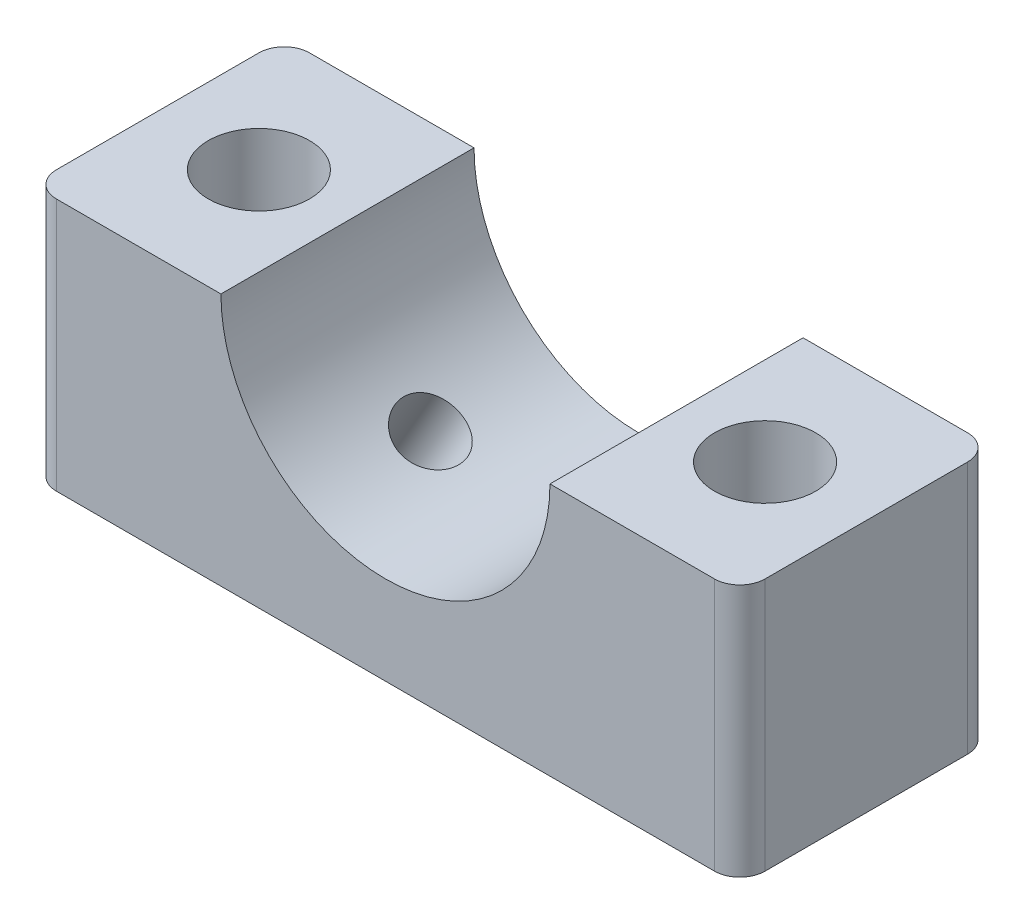
ISO-10303-21;
HEADER;
FILE_DESCRIPTION(('STEP AP214'),'2;1');
FILE_NAME('part.step','',(''),(''),'','','');
FILE_SCHEMA(('AUTOMOTIVE_DESIGN { 1 0 10303 214 1 1 1 1 }'));
ENDSEC;
DATA;
#1=APPLICATION_CONTEXT('core data for automotive mechanical design processes');
#2=APPLICATION_PROTOCOL_DEFINITION('international standard','automotive_design',2000,#1);
#3=PRODUCT_CONTEXT('',#1,'mechanical');
#4=PRODUCT('Part','Part','',(#3));
#5=PRODUCT_RELATED_PRODUCT_CATEGORY('part','',(#4));
#6=PRODUCT_DEFINITION_FORMATION('','',#4);
#7=PRODUCT_DEFINITION_CONTEXT('part definition',#1,'design');
#8=PRODUCT_DEFINITION('design','',#6,#7);
#9=PRODUCT_DEFINITION_SHAPE('','',#8);
#10=(LENGTH_UNIT() NAMED_UNIT(*) SI_UNIT(.MILLI.,.METRE.));
#11=(NAMED_UNIT(*) PLANE_ANGLE_UNIT() SI_UNIT($,.RADIAN.));
#12=(NAMED_UNIT(*) SI_UNIT($,.STERADIAN.) SOLID_ANGLE_UNIT());
#13=UNCERTAINTY_MEASURE_WITH_UNIT(LENGTH_MEASURE(1.E-05),#10,'distance_accuracy_value','');
#14=(GEOMETRIC_REPRESENTATION_CONTEXT(3) GLOBAL_UNCERTAINTY_ASSIGNED_CONTEXT((#13)) GLOBAL_UNIT_ASSIGNED_CONTEXT((#10,
#11,#12)) REPRESENTATION_CONTEXT('',''));
#15=CARTESIAN_POINT('',(0.,0.,0.));
#16=DIRECTION('',(0.,0.,1.));
#17=DIRECTION('',(1.,0.,0.));
#18=AXIS2_PLACEMENT_3D('',#15,#16,#17);
#19=CARTESIAN_POINT('',(-14.,10.,5.));
#20=DIRECTION('',(1.,0.,0.));
#21=DIRECTION('',(0.,0.,-1.));
#22=AXIS2_PLACEMENT_3D('',#19,#20,#21);
#23=PLANE('',#22);
#24=DIRECTION('',(0.,0.,-1.));
#25=VECTOR('',#24,1.);
#26=CARTESIAN_POINT('',(-14.,10.,5.));
#27=LINE('',#26,#25);
#28=CARTESIAN_POINT('',(-14.,10.,4.));
#29=VERTEX_POINT('',#28);
#30=CARTESIAN_POINT('',(-14.,10.,-4.));
#31=VERTEX_POINT('',#30);
#32=EDGE_CURVE('E141',#29,#31,#27,.T.);
#33=ORIENTED_EDGE('',*,*,#32,.T.);
#34=DIRECTION('',(0.,-1.,0.));
#35=VECTOR('',#34,1.);
#36=CARTESIAN_POINT('',(-14.,10.,-4.));
#37=LINE('',#36,#35);
#38=CARTESIAN_POINT('',(-14.,0.,-4.));
#39=VERTEX_POINT('',#38);
#40=EDGE_CURVE('E244',#31,#39,#37,.T.);
#41=ORIENTED_EDGE('',*,*,#40,.T.);
#42=DIRECTION('',(0.,0.,-1.));
#43=VECTOR('',#42,1.);
#44=CARTESIAN_POINT('',(-14.,0.,5.));
#45=LINE('',#44,#43);
#46=CARTESIAN_POINT('',(-14.,0.,4.));
#47=VERTEX_POINT('',#46);
#48=EDGE_CURVE('E163',#47,#39,#45,.T.);
#49=ORIENTED_EDGE('',*,*,#48,.F.);
#50=DIRECTION('',(0.,-1.,0.));
#51=VECTOR('',#50,1.);
#52=CARTESIAN_POINT('',(-14.,10.,4.));
#53=LINE('',#52,#51);
#54=EDGE_CURVE('E170',#47,#29,#53,.F.);
#55=ORIENTED_EDGE('',*,*,#54,.T.);
#56=EDGE_LOOP('',(#33,#41,#49,#55));
#57=FACE_BOUND('',#56,.T.);
#58=ADVANCED_FACE('F39',(#57),#23,.F.);
#59=CARTESIAN_POINT('',(-14.,0.,5.));
#60=DIRECTION('',(0.,1.,0.));
#61=DIRECTION('',(0.,0.,1.));
#62=AXIS2_PLACEMENT_3D('',#59,#60,#61);
#63=PLANE('',#62);
#64=CARTESIAN_POINT('',(-10.,0.,0.));
#65=DIRECTION('',(0.,1.,0.));
#66=DIRECTION('',(0.,0.,1.));
#67=AXIS2_PLACEMENT_3D('',#64,#65,#66);
#68=CIRCLE('',#67,2.);
#69=CARTESIAN_POINT('',(-10.,0.,2.));
#70=VERTEX_POINT('',#69);
#71=EDGE_CURVE('E178',#70,#70,#68,.F.);
#72=ORIENTED_EDGE('',*,*,#71,.F.);
#73=EDGE_LOOP('',(#72));
#74=FACE_BOUND('',#73,.T.);
#75=CARTESIAN_POINT('',(10.,0.,0.));
#76=DIRECTION('',(0.,1.,0.));
#77=DIRECTION('',(0.,0.,1.));
#78=AXIS2_PLACEMENT_3D('',#75,#76,#77);
#79=CIRCLE('',#78,2.);
#80=CARTESIAN_POINT('',(10.,0.,2.));
#81=VERTEX_POINT('',#80);
#82=EDGE_CURVE('E268',#81,#81,#79,.F.);
#83=ORIENTED_EDGE('',*,*,#82,.F.);
#84=EDGE_LOOP('',(#83));
#85=FACE_BOUND('',#84,.T.);
#86=CARTESIAN_POINT('',(-5.77350269189618,0.,0.));
#87=DIRECTION('',(0.,1.,0.));
#88=DIRECTION('',(1.,0.,0.));
#89=AXIS2_PLACEMENT_3D('',#86,#87,#88);
#90=ELLIPSE('',#89,1.44337567297406,1.25);
#91=CARTESIAN_POINT('',(-4.33012701892212,0.,0.));
#92=VERTEX_POINT('',#91);
#93=EDGE_CURVE('E147',#92,#92,#90,.T.);
#94=ORIENTED_EDGE('',*,*,#93,.T.);
#95=EDGE_LOOP('',(#94));
#96=FACE_BOUND('',#95,.T.);
#97=ORIENTED_EDGE('',*,*,#48,.T.);
#98=CARTESIAN_POINT('',(-13.,0.,-4.));
#99=DIRECTION('',(0.,1.,0.));
#100=DIRECTION('',(0.,0.,1.));
#101=AXIS2_PLACEMENT_3D('',#98,#99,#100);
#102=CIRCLE('',#101,1.);
#103=CARTESIAN_POINT('',(-13.,0.,-5.));
#104=VERTEX_POINT('',#103);
#105=EDGE_CURVE('E239',#39,#104,#102,.F.);
#106=ORIENTED_EDGE('',*,*,#105,.T.);
#107=DIRECTION('',(1.,0.,0.));
#108=VECTOR('',#107,1.);
#109=CARTESIAN_POINT('',(-14.,0.,-5.));
#110=LINE('',#109,#108);
#111=CARTESIAN_POINT('',(13.,0.,-5.));
#112=VERTEX_POINT('',#111);
#113=EDGE_CURVE('E150',#104,#112,#110,.T.);
#114=ORIENTED_EDGE('',*,*,#113,.T.);
#115=CARTESIAN_POINT('',(13.,0.,-4.));
#116=DIRECTION('',(0.,1.,0.));
#117=DIRECTION('',(0.,0.,1.));
#118=AXIS2_PLACEMENT_3D('',#115,#116,#117);
#119=CIRCLE('',#118,1.);
#120=CARTESIAN_POINT('',(14.,0.,-4.));
#121=VERTEX_POINT('',#120);
#122=EDGE_CURVE('E237',#112,#121,#119,.F.);
#123=ORIENTED_EDGE('',*,*,#122,.T.);
#124=DIRECTION('',(0.,0.,-1.));
#125=VECTOR('',#124,1.);
#126=CARTESIAN_POINT('',(14.,0.,5.));
#127=LINE('',#126,#125);
#128=CARTESIAN_POINT('',(14.,0.,4.));
#129=VERTEX_POINT('',#128);
#130=EDGE_CURVE('E161',#129,#121,#127,.T.);
#131=ORIENTED_EDGE('',*,*,#130,.F.);
#132=CARTESIAN_POINT('',(13.,0.,4.));
#133=DIRECTION('',(0.,1.,0.));
#134=DIRECTION('',(0.,0.,1.));
#135=AXIS2_PLACEMENT_3D('',#132,#133,#134);
#136=CIRCLE('',#135,1.);
#137=CARTESIAN_POINT('',(13.,0.,5.));
#138=VERTEX_POINT('',#137);
#139=EDGE_CURVE('E233',#129,#138,#136,.F.);
#140=ORIENTED_EDGE('',*,*,#139,.T.);
#141=DIRECTION('',(1.,0.,0.));
#142=VECTOR('',#141,1.);
#143=CARTESIAN_POINT('',(-14.,0.,5.));
#144=LINE('',#143,#142);
#145=CARTESIAN_POINT('',(-13.,0.,5.));
#146=VERTEX_POINT('',#145);
#147=EDGE_CURVE('E124',#146,#138,#144,.T.);
#148=ORIENTED_EDGE('',*,*,#147,.F.);
#149=CARTESIAN_POINT('',(-13.,0.,4.));
#150=DIRECTION('',(0.,1.,0.));
#151=DIRECTION('',(0.,0.,1.));
#152=AXIS2_PLACEMENT_3D('',#149,#150,#151);
#153=CIRCLE('',#152,1.);
#154=EDGE_CURVE('E240',#146,#47,#153,.F.);
#155=ORIENTED_EDGE('',*,*,#154,.T.);
#156=EDGE_LOOP('',(#97,#106,#114,#123,#131,#140,#148,#155));
#157=FACE_BOUND('',#156,.T.);
#158=ADVANCED_FACE('F206',(#74,#85,#96,#157),#63,.F.);
#159=CARTESIAN_POINT('',(14.,10.,5.));
#160=DIRECTION('',(-1.,0.,0.));
#161=DIRECTION('',(0.,0.,1.));
#162=AXIS2_PLACEMENT_3D('',#159,#160,#161);
#163=PLANE('',#162);
#164=ORIENTED_EDGE('',*,*,#130,.T.);
#165=DIRECTION('',(0.,1.,0.));
#166=VECTOR('',#165,1.);
#167=CARTESIAN_POINT('',(14.,10.,-4.));
#168=LINE('',#167,#166);
#169=CARTESIAN_POINT('',(14.,10.,-4.));
#170=VERTEX_POINT('',#169);
#171=EDGE_CURVE('E255',#121,#170,#168,.T.);
#172=ORIENTED_EDGE('',*,*,#171,.T.);
#173=DIRECTION('',(0.,0.,-1.));
#174=VECTOR('',#173,1.);
#175=CARTESIAN_POINT('',(14.,10.,5.));
#176=LINE('',#175,#174);
#177=CARTESIAN_POINT('',(14.,10.,4.));
#178=VERTEX_POINT('',#177);
#179=EDGE_CURVE('E132',#178,#170,#176,.T.);
#180=ORIENTED_EDGE('',*,*,#179,.F.);
#181=DIRECTION('',(0.,1.,0.));
#182=VECTOR('',#181,1.);
#183=CARTESIAN_POINT('',(14.,0.,4.));
#184=LINE('',#183,#182);
#185=EDGE_CURVE('E235',#178,#129,#184,.F.);
#186=ORIENTED_EDGE('',*,*,#185,.T.);
#187=EDGE_LOOP('',(#164,#172,#180,#186));
#188=FACE_BOUND('',#187,.T.);
#189=ADVANCED_FACE('F213',(#188),#163,.F.);
#190=CARTESIAN_POINT('',(6.5,10.,5.));
#191=DIRECTION('',(0.,-1.,0.));
#192=DIRECTION('',(0.,0.,-1.));
#193=AXIS2_PLACEMENT_3D('',#190,#191,#192);
#194=PLANE('',#193);
#195=CARTESIAN_POINT('',(10.,10.,0.));
#196=DIRECTION('',(0.,1.,0.));
#197=DIRECTION('',(0.,0.,1.));
#198=AXIS2_PLACEMENT_3D('',#195,#196,#197);
#199=CIRCLE('',#198,2.);
#200=CARTESIAN_POINT('',(10.,10.,2.));
#201=VERTEX_POINT('',#200);
#202=EDGE_CURVE('E262',#201,#201,#199,.T.);
#203=ORIENTED_EDGE('',*,*,#202,.F.);
#204=EDGE_LOOP('',(#203));
#205=FACE_BOUND('',#204,.T.);
#206=ORIENTED_EDGE('',*,*,#179,.T.);
#207=CARTESIAN_POINT('',(13.,10.,-4.));
#208=DIRECTION('',(0.,-1.,0.));
#209=DIRECTION('',(0.,0.,-1.));
#210=AXIS2_PLACEMENT_3D('',#207,#208,#209);
#211=CIRCLE('',#210,1.);
#212=CARTESIAN_POINT('',(13.,10.,-5.));
#213=VERTEX_POINT('',#212);
#214=EDGE_CURVE('E64',#170,#213,#211,.F.);
#215=ORIENTED_EDGE('',*,*,#214,.T.);
#216=DIRECTION('',(-1.,0.,0.));
#217=VECTOR('',#216,1.);
#218=CARTESIAN_POINT('',(6.5,10.,-5.));
#219=LINE('',#218,#217);
#220=CARTESIAN_POINT('',(6.5,10.,-5.));
#221=VERTEX_POINT('',#220);
#222=EDGE_CURVE('E131',#213,#221,#219,.T.);
#223=ORIENTED_EDGE('',*,*,#222,.T.);
#224=DIRECTION('',(0.,0.,-1.));
#225=VECTOR('',#224,1.);
#226=CARTESIAN_POINT('',(6.5,10.,5.));
#227=LINE('',#226,#225);
#228=CARTESIAN_POINT('',(6.5,10.,5.));
#229=VERTEX_POINT('',#228);
#230=EDGE_CURVE('E126',#229,#221,#227,.T.);
#231=ORIENTED_EDGE('',*,*,#230,.F.);
#232=DIRECTION('',(-1.,0.,0.));
#233=VECTOR('',#232,1.);
#234=CARTESIAN_POINT('',(6.5,10.,5.));
#235=LINE('',#234,#233);
#236=CARTESIAN_POINT('',(13.,10.,5.));
#237=VERTEX_POINT('',#236);
#238=EDGE_CURVE('E119',#237,#229,#235,.T.);
#239=ORIENTED_EDGE('',*,*,#238,.F.);
#240=CARTESIAN_POINT('',(13.,10.,4.));
#241=DIRECTION('',(0.,-1.,0.));
#242=DIRECTION('',(0.,0.,-1.));
#243=AXIS2_PLACEMENT_3D('',#240,#241,#242);
#244=CIRCLE('',#243,1.);
#245=EDGE_CURVE('E53',#237,#178,#244,.F.);
#246=ORIENTED_EDGE('',*,*,#245,.T.);
#247=EDGE_LOOP('',(#206,#215,#223,#231,#239,#246));
#248=FACE_BOUND('',#247,.T.);
#249=ADVANCED_FACE('F128',(#205,#248),#194,.F.);
#250=CARTESIAN_POINT('',(0.,10.,5.));
#251=DIRECTION('',(0.,0.,-1.));
#252=DIRECTION('',(-1.,0.,0.));
#253=AXIS2_PLACEMENT_3D('',#250,#251,#252);
#254=CYLINDRICAL_SURFACE('',#253,6.5);
#255=CARTESIAN_POINT('',(-4.27186946027379,5.10090505150388,0.));
#256=CARTESIAN_POINT('',(-4.27186786234572,5.10090255690933,-0.0695129298701198));
#257=CARTESIAN_POINT('',(-4.26740512682388,5.09700122847107,-0.139059615060495));
#258=CARTESIAN_POINT('',(-4.24963701126365,5.08159391997354,-0.276189529414037));
#259=CARTESIAN_POINT('',(-4.23632429076355,5.07008162717971,-0.343771080023577));
#260=CARTESIAN_POINT('',(-4.20114024976737,5.04006538431201,-0.474966822381258));
#261=CARTESIAN_POINT('',(-4.17927710502213,5.02156811371931,-0.538584736914954));
#262=CARTESIAN_POINT('',(-4.12742162531225,4.97849407623224,-0.660186274966829));
#263=CARTESIAN_POINT('',(-4.09742985625943,4.95391773257111,-0.71817029033336));
#264=CARTESIAN_POINT('',(-4.02948728504457,4.89949575207392,-0.82762060621887));
#265=CARTESIAN_POINT('',(-3.9914472491581,4.86959168736392,-0.879002474754331));
#266=CARTESIAN_POINT('',(-3.90837101927232,4.80602594237118,-0.973053765073603));
#267=CARTESIAN_POINT('',(-3.86333435476037,4.77236400942037,-1.01572260047221));
#268=CARTESIAN_POINT('',(-3.76681408584734,4.70238849172243,-1.09146170512889));
#269=CARTESIAN_POINT('',(-3.71528160693781,4.66605578122765,-1.12445212935253));
#270=CARTESIAN_POINT('',(-3.60725951597224,4.59241772086044,-1.17938321266358));
#271=CARTESIAN_POINT('',(-3.5507703332067,4.55511245541544,-1.20132482755992));
#272=CARTESIAN_POINT('',(-3.4350041577032,4.48135911982108,-1.23327370175281));
#273=CARTESIAN_POINT('',(-3.37576961815053,4.44490614484092,-1.24342338756003));
#274=CARTESIAN_POINT('',(-3.25552415623735,4.37359382706998,-1.25194429161107));
#275=CARTESIAN_POINT('',(-3.19451339314361,4.33873434211342,-1.250316562668));
#276=CARTESIAN_POINT('',(-3.07331712468633,4.27204701198184,-1.23543761869705));
#277=CARTESIAN_POINT('',(-3.01313133400894,4.24018528352899,-1.22233978343455));
#278=CARTESIAN_POINT('',(-2.89456598347944,4.17969760109925,-1.18513527284376));
#279=CARTESIAN_POINT('',(-2.83618649203094,4.15107176955544,-1.16102818114417));
#280=CARTESIAN_POINT('',(-2.72266845744444,4.09736953229711,-1.10234485892795));
#281=CARTESIAN_POINT('',(-2.66755103811545,4.07231503500744,-1.06770777735751));
#282=CARTESIAN_POINT('',(-2.56263799935389,4.02620931553274,-0.988992603030234));
#283=CARTESIAN_POINT('',(-2.51284294893593,4.00515852119657,-0.944913502337155));
#284=CARTESIAN_POINT('',(-2.41941143172443,3.96683800639981,-0.847721745415709));
#285=CARTESIAN_POINT('',(-2.37588722108931,3.94963473015615,-0.794474882882506));
#286=CARTESIAN_POINT('',(-2.29746429023925,3.91942195719879,-0.68090491266381));
#287=CARTESIAN_POINT('',(-2.26256570956569,3.90641252833013,-0.620581690523575));
#288=CARTESIAN_POINT('',(-2.2026110342155,3.88448444690811,-0.494392991364381));
#289=CARTESIAN_POINT('',(-2.17757335231011,3.87557344198514,-0.428517422438187));
#290=CARTESIAN_POINT('',(-2.13841741418681,3.86179129009702,-0.293196222810532));
#291=CARTESIAN_POINT('',(-2.12429785108225,3.85691965961819,-0.223751020451809));
#292=CARTESIAN_POINT('',(-2.10768918720834,3.85120148898217,-0.0844403376857292));
#293=CARTESIAN_POINT('',(-2.10501938345135,3.85029240708824,-0.0145989431580958));
#294=CARTESIAN_POINT('',(-2.11092425337287,3.85231684259029,0.124547681934843));
#295=CARTESIAN_POINT('',(-2.11949834037978,3.85525015950172,0.193852940284296));
#296=CARTESIAN_POINT('',(-2.1474172818142,3.86495215685781,0.329337471596229));
#297=CARTESIAN_POINT('',(-2.16666717084782,3.87168703025384,0.395538802083322));
#298=CARTESIAN_POINT('',(-2.21513219158876,3.8890387121455,0.523644423727257));
#299=CARTESIAN_POINT('',(-2.24434809074071,3.89965581960178,0.585548383517924));
#300=CARTESIAN_POINT('',(-2.31210058251379,3.92500945975876,0.704127121192506));
#301=CARTESIAN_POINT('',(-2.35074574895073,3.93979431485799,0.760729507218858));
#302=CARTESIAN_POINT('',(-2.43583031046001,3.97349026578458,0.866342559432979));
#303=CARTESIAN_POINT('',(-2.48227044442967,3.99240175283298,0.915352505073589));
#304=CARTESIAN_POINT('',(-2.58212434836235,4.03463262464552,1.00509487601673));
#305=CARTESIAN_POINT('',(-2.63562725990501,4.05801043249425,1.04570076602869));
#306=CARTESIAN_POINT('',(-2.7473391097569,4.10882967401384,1.11658765304746));
#307=CARTESIAN_POINT('',(-2.80554786032664,4.13627094560906,1.14686906169832));
#308=CARTESIAN_POINT('',(-2.92448389401294,4.19467869595212,1.19605986491778));
#309=CARTESIAN_POINT('',(-2.98519570282088,4.22562512376527,1.21503040532308));
#310=CARTESIAN_POINT('',(-3.10753061655796,4.29053031100355,1.2412555973101));
#311=CARTESIAN_POINT('',(-3.16915361961863,4.32448873578771,1.24851154869842));
#312=CARTESIAN_POINT('',(-3.29045071205204,4.39395493904277,1.25105441574627));
#313=CARTESIAN_POINT('',(-3.35014020575897,4.42942897976648,1.24653211116508));
#314=CARTESIAN_POINT('',(-3.46691699931558,4.5013465188102,1.22606595991718));
#315=CARTESIAN_POINT('',(-3.52400432694983,4.53779000677239,1.21012223523286));
#316=CARTESIAN_POINT('',(-3.6339899337391,4.6103383498243,1.16734790380587));
#317=CARTESIAN_POINT('',(-3.68689616762107,4.64644372682816,1.140538595824));
#318=CARTESIAN_POINT('',(-3.78741162856796,4.71707551260145,1.07681744274669));
#319=CARTESIAN_POINT('',(-3.83502047597357,4.75160180809511,1.03990487421402));
#320=CARTESIAN_POINT('',(-3.92460231013328,4.81823735702435,0.956373274834163));
#321=CARTESIAN_POINT('',(-3.96648001542138,4.85030257098361,0.909616913957638));
#322=CARTESIAN_POINT('',(-4.04290664697218,4.9100819433049,0.808008908722966));
#323=CARTESIAN_POINT('',(-4.07745384330514,4.93779507421698,0.753155358673284));
#324=CARTESIAN_POINT('',(-4.13883914765208,4.98785483614504,0.636265080511121));
#325=CARTESIAN_POINT('',(-4.16559824464004,5.010146112383,0.574163120495855));
#326=CARTESIAN_POINT('',(-4.21039425164882,5.04788478057407,0.444979613077635));
#327=CARTESIAN_POINT('',(-4.22843927469324,5.06333853730341,0.377902764817236));
#328=CARTESIAN_POINT('',(-4.25188761832677,5.08353597919156,0.258870812634622));
#329=CARTESIAN_POINT('',(-4.25937182171334,5.09003099125745,0.207606006200682));
#330=CARTESIAN_POINT('',(-4.26936326759277,5.09871639854251,0.104233776828429));
#331=CARTESIAN_POINT('',(-4.27187065852862,5.10090692215128,0.0521263790687548));
#332=CARTESIAN_POINT('',(-4.27186946027379,5.10090505150388,0.));
#333=B_SPLINE_CURVE_WITH_KNOTS('',3,(#255,#256,#257,#258,#259,#260,#261,#262,#263,#264,#265,
#266,#267,#268,#269,#270,#271,#272,#273,#274,#275,#276,#277,#278,#279,#280,#281,#282,#283,#284,
#285,#286,#287,#288,#289,#290,#291,#292,#293,#294,#295,#296,#297,#298,#299,#300,#301,#302,#303,
#304,#305,#306,#307,#308,#309,#310,#311,#312,#313,#314,#315,#316,#317,#318,#319,#320,#321,#322,
#323,#324,#325,#326,#327,#328,#329,#330,#331,#332),.UNSPECIFIED.,.T.,.F.,(4,2,2,2,2,2,2,2,2,2,2,
2,2,2,2,2,2,2,2,2,2,2,2,2,2,2,2,2,2,2,2,2,2,2,2,2,2,2,4),(0.,0.208347994425065,
0.416869015339834,0.625191138043345,0.833498761161485,1.04424985912792,1.25501513592547,
1.46747321088402,1.67991290338878,1.88975909537704,2.09958652891119,2.30665024511142,
2.513721793133,2.72201348359888,2.93032742030891,3.14200045966176,3.35367692313739,
3.56574678669525,3.77779126179578,3.98647658946278,4.19515102900509,4.40199833043662,
4.60886156399135,4.81822954602393,5.02761738559912,5.23995929713474,5.45229274146446,
5.66346766485102,5.87461915545405,6.08237184297279,6.29012231169614,6.49746750164926,
6.70482754230238,6.91529891011172,7.12581989203803,7.33840759539418,7.55079699078516,
7.70703771468348,7.86327377833246),.UNSPECIFIED.);
#334=CARTESIAN_POINT('',(-4.27186946027379,5.10090505150388,0.));
#335=VERTEX_POINT('',#334);
#336=EDGE_CURVE('E169',#335,#335,#333,.T.);
#337=ORIENTED_EDGE('',*,*,#336,.T.);
#338=EDGE_LOOP('',(#337));
#339=FACE_BOUND('',#338,.T.);
#340=CARTESIAN_POINT('',(0.,10.,-5.));
#341=DIRECTION('',(0.,0.,-1.));
#342=DIRECTION('',(1.,0.,0.));
#343=AXIS2_PLACEMENT_3D('',#340,#341,#342);
#344=CIRCLE('',#343,6.5);
#345=CARTESIAN_POINT('',(-6.5,10.,-5.));
#346=VERTEX_POINT('',#345);
#347=EDGE_CURVE('E155',#221,#346,#344,.T.);
#348=ORIENTED_EDGE('',*,*,#347,.T.);
#349=DIRECTION('',(0.,0.,-1.));
#350=VECTOR('',#349,1.);
#351=CARTESIAN_POINT('',(-6.5,10.,5.));
#352=LINE('',#351,#350);
#353=CARTESIAN_POINT('',(-6.5,10.,5.));
#354=VERTEX_POINT('',#353);
#355=EDGE_CURVE('E138',#354,#346,#352,.T.);
#356=ORIENTED_EDGE('',*,*,#355,.F.);
#357=CARTESIAN_POINT('',(0.,10.,5.));
#358=DIRECTION('',(0.,0.,-1.));
#359=DIRECTION('',(1.,0.,0.));
#360=AXIS2_PLACEMENT_3D('',#357,#358,#359);
#361=CIRCLE('',#360,6.5);
#362=EDGE_CURVE('E125',#229,#354,#361,.T.);
#363=ORIENTED_EDGE('',*,*,#362,.F.);
#364=ORIENTED_EDGE('',*,*,#230,.T.);
#365=EDGE_LOOP('',(#348,#356,#363,#364));
#366=FACE_BOUND('',#365,.T.);
#367=ADVANCED_FACE('F136',(#339,#366),#254,.F.);
#368=CARTESIAN_POINT('',(-14.,10.,5.));
#369=DIRECTION('',(0.,-1.,0.));
#370=DIRECTION('',(0.,0.,-1.));
#371=AXIS2_PLACEMENT_3D('',#368,#369,#370);
#372=PLANE('',#371);
#373=CARTESIAN_POINT('',(-10.,10.,0.));
#374=DIRECTION('',(0.,1.,0.));
#375=DIRECTION('',(0.,0.,1.));
#376=AXIS2_PLACEMENT_3D('',#373,#374,#375);
#377=CIRCLE('',#376,2.);
#378=CARTESIAN_POINT('',(-10.,10.,2.));
#379=VERTEX_POINT('',#378);
#380=EDGE_CURVE('E270',#379,#379,#377,.T.);
#381=ORIENTED_EDGE('',*,*,#380,.F.);
#382=EDGE_LOOP('',(#381));
#383=FACE_BOUND('',#382,.T.);
#384=DIRECTION('',(-1.,0.,0.));
#385=VECTOR('',#384,1.);
#386=CARTESIAN_POINT('',(-14.,10.,-5.));
#387=LINE('',#386,#385);
#388=CARTESIAN_POINT('',(-13.,10.,-5.));
#389=VERTEX_POINT('',#388);
#390=EDGE_CURVE('E152',#346,#389,#387,.T.);
#391=ORIENTED_EDGE('',*,*,#390,.T.);
#392=CARTESIAN_POINT('',(-13.,10.,-4.));
#393=DIRECTION('',(0.,-1.,0.));
#394=DIRECTION('',(0.,0.,-1.));
#395=AXIS2_PLACEMENT_3D('',#392,#393,#394);
#396=CIRCLE('',#395,1.);
#397=EDGE_CURVE('E253',#389,#31,#396,.F.);
#398=ORIENTED_EDGE('',*,*,#397,.T.);
#399=ORIENTED_EDGE('',*,*,#32,.F.);
#400=CARTESIAN_POINT('',(-13.,10.,4.));
#401=DIRECTION('',(0.,-1.,0.));
#402=DIRECTION('',(0.,0.,-1.));
#403=AXIS2_PLACEMENT_3D('',#400,#401,#402);
#404=CIRCLE('',#403,1.);
#405=CARTESIAN_POINT('',(-13.,10.,5.));
#406=VERTEX_POINT('',#405);
#407=EDGE_CURVE('E247',#29,#406,#404,.F.);
#408=ORIENTED_EDGE('',*,*,#407,.T.);
#409=DIRECTION('',(-1.,0.,0.));
#410=VECTOR('',#409,1.);
#411=CARTESIAN_POINT('',(-14.,10.,5.));
#412=LINE('',#411,#410);
#413=EDGE_CURVE('E143',#354,#406,#412,.T.);
#414=ORIENTED_EDGE('',*,*,#413,.F.);
#415=ORIENTED_EDGE('',*,*,#355,.T.);
#416=EDGE_LOOP('',(#391,#398,#399,#408,#414,#415));
#417=FACE_BOUND('',#416,.T.);
#418=ADVANCED_FACE('F191',(#383,#417),#372,.F.);
#419=CARTESIAN_POINT('',(0.,10.,5.));
#420=DIRECTION('',(0.,0.,1.));
#421=DIRECTION('',(1.,0.,0.));
#422=AXIS2_PLACEMENT_3D('',#419,#420,#421);
#423=PLANE('',#422);
#424=ORIENTED_EDGE('',*,*,#147,.T.);
#425=DIRECTION('',(0.,1.,0.));
#426=VECTOR('',#425,1.);
#427=CARTESIAN_POINT('',(13.,10.,5.));
#428=LINE('',#427,#426);
#429=EDGE_CURVE('E11',#138,#237,#428,.T.);
#430=ORIENTED_EDGE('',*,*,#429,.T.);
#431=ORIENTED_EDGE('',*,*,#238,.T.);
#432=ORIENTED_EDGE('',*,*,#362,.T.);
#433=ORIENTED_EDGE('',*,*,#413,.T.);
#434=DIRECTION('',(0.,-1.,0.));
#435=VECTOR('',#434,1.);
#436=CARTESIAN_POINT('',(-13.,0.,5.));
#437=LINE('',#436,#435);
#438=EDGE_CURVE('E50',#406,#146,#437,.T.);
#439=ORIENTED_EDGE('',*,*,#438,.T.);
#440=EDGE_LOOP('',(#424,#430,#431,#432,#433,#439));
#441=FACE_BOUND('',#440,.T.);
#442=ADVANCED_FACE('F118',(#441),#423,.T.);
#443=CARTESIAN_POINT('',(0.,10.,-5.));
#444=DIRECTION('',(0.,0.,1.));
#445=DIRECTION('',(1.,0.,0.));
#446=AXIS2_PLACEMENT_3D('',#443,#444,#445);
#447=PLANE('',#446);
#448=ORIENTED_EDGE('',*,*,#113,.F.);
#449=DIRECTION('',(0.,-1.,0.));
#450=VECTOR('',#449,1.);
#451=CARTESIAN_POINT('',(-13.,10.,-5.));
#452=LINE('',#451,#450);
#453=EDGE_CURVE('E250',#104,#389,#452,.F.);
#454=ORIENTED_EDGE('',*,*,#453,.T.);
#455=ORIENTED_EDGE('',*,*,#390,.F.);
#456=ORIENTED_EDGE('',*,*,#347,.F.);
#457=ORIENTED_EDGE('',*,*,#222,.F.);
#458=DIRECTION('',(0.,1.,0.));
#459=VECTOR('',#458,1.);
#460=CARTESIAN_POINT('',(13.,10.,-5.));
#461=LINE('',#460,#459);
#462=EDGE_CURVE('E242',#213,#112,#461,.F.);
#463=ORIENTED_EDGE('',*,*,#462,.T.);
#464=EDGE_LOOP('',(#448,#454,#455,#456,#457,#463));
#465=FACE_BOUND('',#464,.T.);
#466=ADVANCED_FACE('F186',(#465),#447,.F.);
#467=CARTESIAN_POINT('',(-2.74844155653398,5.23955958244939,0.));
#468=DIRECTION('',(0.499999999999995,0.866025403784442,0.));
#469=DIRECTION('',(-0.866025403784442,0.499999999999995,0.));
#470=AXIS2_PLACEMENT_3D('',#467,#468,#469);
#471=CYLINDRICAL_SURFACE('',#470,1.25);
#472=ORIENTED_EDGE('',*,*,#336,.F.);
#473=EDGE_LOOP('',(#472));
#474=FACE_BOUND('',#473,.T.);
#475=ORIENTED_EDGE('',*,*,#93,.F.);
#476=EDGE_LOOP('',(#475));
#477=FACE_BOUND('',#476,.T.);
#478=ADVANCED_FACE('F182',(#474,#477),#471,.F.);
#479=CARTESIAN_POINT('',(-10.,-0.00100000000000447,0.));
#480=DIRECTION('',(0.,1.,0.));
#481=DIRECTION('',(0.,0.,1.));
#482=AXIS2_PLACEMENT_3D('',#479,#480,#481);
#483=CYLINDRICAL_SURFACE('',#482,2.);
#484=ORIENTED_EDGE('',*,*,#380,.T.);
#485=EDGE_LOOP('',(#484));
#486=FACE_BOUND('',#485,.T.);
#487=ORIENTED_EDGE('',*,*,#71,.T.);
#488=EDGE_LOOP('',(#487));
#489=FACE_BOUND('',#488,.T.);
#490=ADVANCED_FACE('F189',(#486,#489),#483,.F.);
#491=CARTESIAN_POINT('',(10.,-0.00100000000000447,0.));
#492=DIRECTION('',(0.,1.,0.));
#493=DIRECTION('',(0.,0.,1.));
#494=AXIS2_PLACEMENT_3D('',#491,#492,#493);
#495=CYLINDRICAL_SURFACE('',#494,2.);
#496=ORIENTED_EDGE('',*,*,#202,.T.);
#497=EDGE_LOOP('',(#496));
#498=FACE_BOUND('',#497,.T.);
#499=ORIENTED_EDGE('',*,*,#82,.T.);
#500=EDGE_LOOP('',(#499));
#501=FACE_BOUND('',#500,.T.);
#502=ADVANCED_FACE('F188',(#498,#501),#495,.F.);
#503=CARTESIAN_POINT('',(-13.,10.,-4.));
#504=DIRECTION('',(0.,-1.,0.));
#505=DIRECTION('',(0.,0.,-1.));
#506=AXIS2_PLACEMENT_3D('',#503,#504,#505);
#507=CYLINDRICAL_SURFACE('',#506,1.);
#508=ORIENTED_EDGE('',*,*,#397,.F.);
#509=ORIENTED_EDGE('',*,*,#453,.F.);
#510=ORIENTED_EDGE('',*,*,#105,.F.);
#511=ORIENTED_EDGE('',*,*,#40,.F.);
#512=EDGE_LOOP('',(#508,#509,#510,#511));
#513=FACE_BOUND('',#512,.T.);
#514=ADVANCED_FACE('F217',(#513),#507,.T.);
#515=CARTESIAN_POINT('',(13.,10.,-4.));
#516=DIRECTION('',(0.,1.,0.));
#517=DIRECTION('',(0.,0.,1.));
#518=AXIS2_PLACEMENT_3D('',#515,#516,#517);
#519=CYLINDRICAL_SURFACE('',#518,1.);
#520=ORIENTED_EDGE('',*,*,#122,.F.);
#521=ORIENTED_EDGE('',*,*,#462,.F.);
#522=ORIENTED_EDGE('',*,*,#214,.F.);
#523=ORIENTED_EDGE('',*,*,#171,.F.);
#524=EDGE_LOOP('',(#520,#521,#522,#523));
#525=FACE_BOUND('',#524,.T.);
#526=ADVANCED_FACE('F222',(#525),#519,.T.);
#527=CARTESIAN_POINT('',(13.,10.,4.));
#528=DIRECTION('',(0.,-1.,0.));
#529=DIRECTION('',(0.,0.,-1.));
#530=AXIS2_PLACEMENT_3D('',#527,#528,#529);
#531=CYLINDRICAL_SURFACE('',#530,1.);
#532=ORIENTED_EDGE('',*,*,#139,.F.);
#533=ORIENTED_EDGE('',*,*,#185,.F.);
#534=ORIENTED_EDGE('',*,*,#245,.F.);
#535=ORIENTED_EDGE('',*,*,#429,.F.);
#536=EDGE_LOOP('',(#532,#533,#534,#535));
#537=FACE_BOUND('',#536,.T.);
#538=ADVANCED_FACE('F221',(#537),#531,.T.);
#539=CARTESIAN_POINT('',(-13.,10.,4.));
#540=DIRECTION('',(0.,1.,0.));
#541=DIRECTION('',(0.,0.,1.));
#542=AXIS2_PLACEMENT_3D('',#539,#540,#541);
#543=CYLINDRICAL_SURFACE('',#542,1.);
#544=ORIENTED_EDGE('',*,*,#407,.F.);
#545=ORIENTED_EDGE('',*,*,#54,.F.);
#546=ORIENTED_EDGE('',*,*,#154,.F.);
#547=ORIENTED_EDGE('',*,*,#438,.F.);
#548=EDGE_LOOP('',(#544,#545,#546,#547));
#549=FACE_BOUND('',#548,.T.);
#550=ADVANCED_FACE('F41',(#549),#543,.T.);
#551=CLOSED_SHELL('',(#58,#158,#189,#249,#367,#418,#442,#466,#478,#490,#502,#514,#526,#538,#550));
#552=MANIFOLD_SOLID_BREP('B2',#551);
#553=ADVANCED_BREP_SHAPE_REPRESENTATION('',(#18,#552),#14);
#554=SHAPE_DEFINITION_REPRESENTATION(#9,#553);
ENDSEC;
END-ISO-10303-21;
